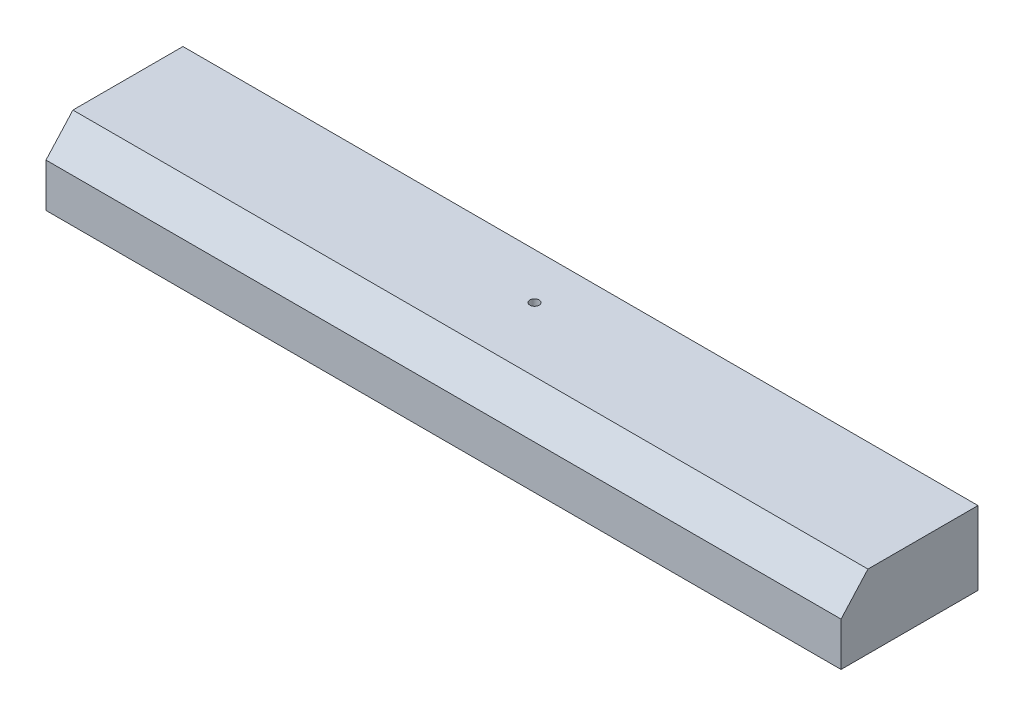
ISO-10303-21;
HEADER;
FILE_DESCRIPTION(('STEP AP214'),'2;1');
FILE_NAME('part.step','',(''),(''),'','','');
FILE_SCHEMA(('AUTOMOTIVE_DESIGN { 1 0 10303 214 1 1 1 1 }'));
ENDSEC;
DATA;
#1=APPLICATION_CONTEXT('core data for automotive mechanical design processes');
#2=APPLICATION_PROTOCOL_DEFINITION('international standard','automotive_design',2000,#1);
#3=PRODUCT_CONTEXT('',#1,'mechanical');
#4=PRODUCT('Part','Part','',(#3));
#5=PRODUCT_RELATED_PRODUCT_CATEGORY('part','',(#4));
#6=PRODUCT_DEFINITION_FORMATION('','',#4);
#7=PRODUCT_DEFINITION_CONTEXT('part definition',#1,'design');
#8=PRODUCT_DEFINITION('design','',#6,#7);
#9=PRODUCT_DEFINITION_SHAPE('','',#8);
#10=(LENGTH_UNIT() NAMED_UNIT(*) SI_UNIT(.MILLI.,.METRE.));
#11=(NAMED_UNIT(*) PLANE_ANGLE_UNIT() SI_UNIT($,.RADIAN.));
#12=(NAMED_UNIT(*) SI_UNIT($,.STERADIAN.) SOLID_ANGLE_UNIT());
#13=UNCERTAINTY_MEASURE_WITH_UNIT(LENGTH_MEASURE(1.E-05),#10,'distance_accuracy_value','');
#14=(GEOMETRIC_REPRESENTATION_CONTEXT(3) GLOBAL_UNCERTAINTY_ASSIGNED_CONTEXT((#13)) GLOBAL_UNIT_ASSIGNED_CONTEXT((#10,
#11,#12)) REPRESENTATION_CONTEXT('',''));
#15=CARTESIAN_POINT('',(0.,0.,0.));
#16=DIRECTION('',(0.,0.,1.));
#17=DIRECTION('',(1.,0.,0.));
#18=AXIS2_PLACEMENT_3D('',#15,#16,#17);
#19=CARTESIAN_POINT('',(81.5,14.,0.));
#20=CARTESIAN_POINT('',(74.436091258729,14.,-13.8819278627372));
#21=CARTESIAN_POINT('',(43.2593569608998,14.,-16.3621882759502));
#22=CARTESIAN_POINT('',(0.,14.,-18.5559275364417));
#23=CARTESIAN_POINT('',(-43.2593569608998,14.,-16.3621882759502));
#24=CARTESIAN_POINT('',(-74.436091258729,14.,-13.8819278627372));
#25=CARTESIAN_POINT('',(-81.5,14.,0.));
#26=B_SPLINE_CURVE_WITH_KNOTS('',3,(#19,#20,#21,#22,#23,#24,#25),.UNSPECIFIED.,.F.,.F.,(4,1,1,1,
4),(0.,0.237125687669127,0.5,0.762874312330873,1.),.UNSPECIFIED.);
#27=DIRECTION('',(0.,-1.,0.));
#28=VECTOR('',#27,1.);
#29=SURFACE_OF_LINEAR_EXTRUSION('',#26,#28);
#30=CARTESIAN_POINT('',(81.5,8.5,0.));
#31=CARTESIAN_POINT('',(74.436091258729,8.5,-13.8819278627372));
#32=CARTESIAN_POINT('',(43.2593569608998,8.5,-16.3621882759502));
#33=CARTESIAN_POINT('',(0.,8.5,-18.5559275364417));
#34=CARTESIAN_POINT('',(-43.2593569608998,8.5,-16.3621882759502));
#35=CARTESIAN_POINT('',(-74.436091258729,8.5,-13.8819278627372));
#36=CARTESIAN_POINT('',(-81.5,8.5,0.));
#37=B_SPLINE_CURVE_WITH_KNOTS('',3,(#30,#31,#32,#33,#34,#35,#36),.UNSPECIFIED.,.F.,.F.,(4,1,1,1,
4),(0.,0.237125687669127,0.5,0.762874312330873,1.),.UNSPECIFIED.);
#38=CARTESIAN_POINT('',(-7.93134864124332,8.5,-17.7313486412434));
#39=VERTEX_POINT('',#38);
#40=CARTESIAN_POINT('',(7.93134864124332,8.5,-17.7313486412434));
#41=VERTEX_POINT('',#40);
#42=EDGE_CURVE('E45',#39,#41,#37,.F.);
#43=ORIENTED_EDGE('',*,*,#42,.F.);
#44=DIRECTION('',(0.,1.,0.));
#45=VECTOR('',#44,1.);
#46=CARTESIAN_POINT('',(-7.93134864124332,8.5,-17.7313486412434));
#47=LINE('',#46,#45);
#48=CARTESIAN_POINT('',(-7.93134864124332,14.,-17.7313486412434));
#49=VERTEX_POINT('',#48);
#50=EDGE_CURVE('E166',#39,#49,#47,.T.);
#51=ORIENTED_EDGE('',*,*,#50,.T.);
#52=CARTESIAN_POINT('',(-81.5,14.,0.));
#53=VERTEX_POINT('',#52);
#54=EDGE_CURVE('E190',#49,#53,#26,.T.);
#55=ORIENTED_EDGE('',*,*,#54,.T.);
#56=DIRECTION('',(0.,-1.,0.));
#57=VECTOR('',#56,1.);
#58=CARTESIAN_POINT('',(-81.5,14.,0.));
#59=LINE('',#58,#57);
#60=CARTESIAN_POINT('',(-81.5,0.,0.));
#61=VERTEX_POINT('',#60);
#62=EDGE_CURVE('E229',#53,#61,#59,.T.);
#63=ORIENTED_EDGE('',*,*,#62,.T.);
#64=CARTESIAN_POINT('',(81.5,0.,0.));
#65=CARTESIAN_POINT('',(74.436091258729,0.,-13.8819278627372));
#66=CARTESIAN_POINT('',(43.2593569608998,0.,-16.3621882759502));
#67=CARTESIAN_POINT('',(0.,0.,-18.5559275364417));
#68=CARTESIAN_POINT('',(-43.2593569608998,0.,-16.3621882759502));
#69=CARTESIAN_POINT('',(-74.436091258729,0.,-13.8819278627372));
#70=CARTESIAN_POINT('',(-81.5,0.,0.));
#71=B_SPLINE_CURVE_WITH_KNOTS('',3,(#64,#65,#66,#67,#68,#69,#70),.UNSPECIFIED.,.F.,.F.,(4,1,1,1,
4),(0.,0.237125687669127,0.5,0.762874312330873,1.),.UNSPECIFIED.);
#72=CARTESIAN_POINT('',(81.5,0.,0.));
#73=VERTEX_POINT('',#72);
#74=EDGE_CURVE('E184',#73,#61,#71,.T.);
#75=ORIENTED_EDGE('',*,*,#74,.F.);
#76=DIRECTION('',(0.,-1.,0.));
#77=VECTOR('',#76,1.);
#78=CARTESIAN_POINT('',(81.5,14.,0.));
#79=LINE('',#78,#77);
#80=CARTESIAN_POINT('',(81.5,14.,0.));
#81=VERTEX_POINT('',#80);
#82=EDGE_CURVE('E265',#81,#73,#79,.T.);
#83=ORIENTED_EDGE('',*,*,#82,.F.);
#84=CARTESIAN_POINT('',(7.93134864124332,14.,-17.7313486412434));
#85=VERTEX_POINT('',#84);
#86=EDGE_CURVE('E165',#81,#85,#26,.T.);
#87=ORIENTED_EDGE('',*,*,#86,.T.);
#88=DIRECTION('',(0.,1.,0.));
#89=VECTOR('',#88,1.);
#90=CARTESIAN_POINT('',(7.93134864124332,8.5,-17.7313486412434));
#91=LINE('',#90,#89);
#92=EDGE_CURVE('E159',#41,#85,#91,.T.);
#93=ORIENTED_EDGE('',*,*,#92,.F.);
#94=EDGE_LOOP('',(#43,#51,#55,#63,#75,#83,#87,#93));
#95=FACE_BOUND('',#94,.T.);
#96=ADVANCED_FACE('F37',(#95),#29,.T.);
#97=CARTESIAN_POINT('',(0.,14.,0.));
#98=DIRECTION('',(0.,-1.,0.));
#99=DIRECTION('',(0.,0.,-1.));
#100=AXIS2_PLACEMENT_3D('',#97,#98,#99);
#101=PLANE('',#100);
#102=DIRECTION('',(-0.707106781186546,0.,-0.707106781186549));
#103=VECTOR('',#102,1.);
#104=CARTESIAN_POINT('',(0.,14.,-9.8));
#105=LINE('',#104,#103);
#106=CARTESIAN_POINT('',(0.,14.,-9.8));
#107=VERTEX_POINT('',#106);
#108=EDGE_CURVE('E161',#107,#49,#105,.T.);
#109=ORIENTED_EDGE('',*,*,#108,.F.);
#110=DIRECTION('',(-0.707106781186546,0.,0.707106781186549));
#111=VECTOR('',#110,1.);
#112=CARTESIAN_POINT('',(7.93134864124332,14.,-17.7313486412434));
#113=LINE('',#112,#111);
#114=EDGE_CURVE('E59',#85,#107,#113,.T.);
#115=ORIENTED_EDGE('',*,*,#114,.F.);
#116=ORIENTED_EDGE('',*,*,#86,.F.);
#117=DIRECTION('',(1.,0.,0.));
#118=VECTOR('',#117,1.);
#119=CARTESIAN_POINT('',(-81.5,14.,0.));
#120=LINE('',#119,#118);
#121=EDGE_CURVE('E189',#53,#81,#120,.T.);
#122=ORIENTED_EDGE('',*,*,#121,.F.);
#123=ORIENTED_EDGE('',*,*,#54,.F.);
#124=EDGE_LOOP('',(#109,#115,#116,#122,#123));
#125=FACE_BOUND('',#124,.T.);
#126=ADVANCED_FACE('F199',(#125),#101,.T.);
#127=CARTESIAN_POINT('',(0.,0.,0.));
#128=DIRECTION('',(0.,1.,0.));
#129=DIRECTION('',(0.,0.,1.));
#130=AXIS2_PLACEMENT_3D('',#127,#128,#129);
#131=PLANE('',#130);
#132=DIRECTION('',(0.,0.,1.));
#133=VECTOR('',#132,1.);
#134=CARTESIAN_POINT('',(-86.5,0.,-22.8));
#135=LINE('',#134,#133);
#136=CARTESIAN_POINT('',(-86.5,0.,-22.8));
#137=VERTEX_POINT('',#136);
#138=CARTESIAN_POINT('',(-86.5,0.,7.));
#139=VERTEX_POINT('',#138);
#140=EDGE_CURVE('E222',#137,#139,#135,.T.);
#141=ORIENTED_EDGE('',*,*,#140,.F.);
#142=DIRECTION('',(-1.,0.,0.));
#143=VECTOR('',#142,1.);
#144=CARTESIAN_POINT('',(86.5,0.,-22.8));
#145=LINE('',#144,#143);
#146=CARTESIAN_POINT('',(86.5,0.,-22.8));
#147=VERTEX_POINT('',#146);
#148=EDGE_CURVE('E227',#147,#137,#145,.T.);
#149=ORIENTED_EDGE('',*,*,#148,.F.);
#150=DIRECTION('',(0.,0.,-1.));
#151=VECTOR('',#150,1.);
#152=CARTESIAN_POINT('',(86.5,0.,7.));
#153=LINE('',#152,#151);
#154=CARTESIAN_POINT('',(86.5,0.,7.));
#155=VERTEX_POINT('',#154);
#156=EDGE_CURVE('E225',#155,#147,#153,.T.);
#157=ORIENTED_EDGE('',*,*,#156,.F.);
#158=DIRECTION('',(1.,0.,0.));
#159=VECTOR('',#158,1.);
#160=CARTESIAN_POINT('',(-86.5,0.,7.));
#161=LINE('',#160,#159);
#162=EDGE_CURVE('E131',#139,#155,#161,.T.);
#163=ORIENTED_EDGE('',*,*,#162,.F.);
#164=EDGE_LOOP('',(#141,#149,#157,#163));
#165=FACE_BOUND('',#164,.T.);
#166=ORIENTED_EDGE('',*,*,#74,.T.);
#167=DIRECTION('',(1.,0.,0.));
#168=VECTOR('',#167,1.);
#169=CARTESIAN_POINT('',(-81.5,0.,0.));
#170=LINE('',#169,#168);
#171=EDGE_CURVE('E258',#61,#73,#170,.T.);
#172=ORIENTED_EDGE('',*,*,#171,.T.);
#173=EDGE_LOOP('',(#166,#172));
#174=FACE_BOUND('',#173,.T.);
#175=ADVANCED_FACE('F202',(#165,#174),#131,.F.);
#176=CARTESIAN_POINT('',(-86.5,14.,-22.8));
#177=DIRECTION('',(1.,0.,0.));
#178=DIRECTION('',(0.,0.,-1.));
#179=AXIS2_PLACEMENT_3D('',#176,#177,#178);
#180=PLANE('',#179);
#181=DIRECTION('',(0.,-1.,0.));
#182=VECTOR('',#181,1.);
#183=CARTESIAN_POINT('',(-86.5,14.,7.));
#184=LINE('',#183,#182);
#185=CARTESIAN_POINT('',(-86.5,9.50000000000002,6.99999999999999));
#186=VERTEX_POINT('',#185);
#187=EDGE_CURVE('E133',#186,#139,#184,.T.);
#188=ORIENTED_EDGE('',*,*,#187,.F.);
#189=DIRECTION('',(0.,0.743144825477391,-0.669130606358862));
#190=VECTOR('',#189,1.);
#191=CARTESIAN_POINT('',(-86.5,-37.,48.86878805985));
#192=LINE('',#191,#190);
#193=CARTESIAN_POINT('',(-86.5,16.,1.14737371206397));
#194=VERTEX_POINT('',#193);
#195=EDGE_CURVE('E115',#186,#194,#192,.T.);
#196=ORIENTED_EDGE('',*,*,#195,.T.);
#197=DIRECTION('',(0.,0.,1.));
#198=VECTOR('',#197,1.);
#199=CARTESIAN_POINT('',(-86.5,16.,7.));
#200=LINE('',#199,#198);
#201=CARTESIAN_POINT('',(-86.5,16.,-22.8));
#202=VERTEX_POINT('',#201);
#203=EDGE_CURVE('E177',#202,#194,#200,.T.);
#204=ORIENTED_EDGE('',*,*,#203,.F.);
#205=DIRECTION('',(0.,-1.,0.));
#206=VECTOR('',#205,1.);
#207=CARTESIAN_POINT('',(-86.5,14.,-22.8));
#208=LINE('',#207,#206);
#209=EDGE_CURVE('E138',#202,#137,#208,.T.);
#210=ORIENTED_EDGE('',*,*,#209,.T.);
#211=ORIENTED_EDGE('',*,*,#140,.T.);
#212=EDGE_LOOP('',(#188,#196,#204,#210,#211));
#213=FACE_BOUND('',#212,.T.);
#214=ADVANCED_FACE('F39',(#213),#180,.F.);
#215=CARTESIAN_POINT('',(-86.5,14.,7.));
#216=DIRECTION('',(0.,0.,-1.));
#217=DIRECTION('',(-1.,0.,0.));
#218=AXIS2_PLACEMENT_3D('',#215,#216,#217);
#219=PLANE('',#218);
#220=DIRECTION('',(0.,-1.,0.));
#221=VECTOR('',#220,1.);
#222=CARTESIAN_POINT('',(86.5,14.,7.));
#223=LINE('',#222,#221);
#224=CARTESIAN_POINT('',(86.5,9.49999999999997,7.00000000000002));
#225=VERTEX_POINT('',#224);
#226=EDGE_CURVE('E124',#225,#155,#223,.T.);
#227=ORIENTED_EDGE('',*,*,#226,.F.);
#228=DIRECTION('',(-1.,0.,0.));
#229=VECTOR('',#228,1.);
#230=CARTESIAN_POINT('',(-86.5,9.49999999999999,7.));
#231=LINE('',#230,#229);
#232=EDGE_CURVE('E112',#225,#186,#231,.T.);
#233=ORIENTED_EDGE('',*,*,#232,.T.);
#234=ORIENTED_EDGE('',*,*,#187,.T.);
#235=ORIENTED_EDGE('',*,*,#162,.T.);
#236=EDGE_LOOP('',(#227,#233,#234,#235));
#237=FACE_BOUND('',#236,.T.);
#238=ADVANCED_FACE('F129',(#237),#219,.F.);
#239=CARTESIAN_POINT('',(86.5,14.,7.));
#240=DIRECTION('',(-1.,0.,0.));
#241=DIRECTION('',(0.,0.,1.));
#242=AXIS2_PLACEMENT_3D('',#239,#240,#241);
#243=PLANE('',#242);
#244=DIRECTION('',(0.,0.,-1.));
#245=VECTOR('',#244,1.);
#246=CARTESIAN_POINT('',(86.5,16.,-22.8));
#247=LINE('',#246,#245);
#248=CARTESIAN_POINT('',(86.5,16.,1.14737371206397));
#249=VERTEX_POINT('',#248);
#250=CARTESIAN_POINT('',(86.5,16.,-22.8));
#251=VERTEX_POINT('',#250);
#252=EDGE_CURVE('E127',#249,#251,#247,.T.);
#253=ORIENTED_EDGE('',*,*,#252,.F.);
#254=DIRECTION('',(0.,0.743144825477391,-0.669130606358862));
#255=VECTOR('',#254,1.);
#256=CARTESIAN_POINT('',(86.5,-37.,48.86878805985));
#257=LINE('',#256,#255);
#258=EDGE_CURVE('E52',#225,#249,#257,.T.);
#259=ORIENTED_EDGE('',*,*,#258,.F.);
#260=ORIENTED_EDGE('',*,*,#226,.T.);
#261=ORIENTED_EDGE('',*,*,#156,.T.);
#262=DIRECTION('',(0.,-1.,0.));
#263=VECTOR('',#262,1.);
#264=CARTESIAN_POINT('',(86.5,14.,-22.8));
#265=LINE('',#264,#263);
#266=EDGE_CURVE('E134',#251,#147,#265,.T.);
#267=ORIENTED_EDGE('',*,*,#266,.F.);
#268=EDGE_LOOP('',(#253,#259,#260,#261,#267));
#269=FACE_BOUND('',#268,.T.);
#270=ADVANCED_FACE('F123',(#269),#243,.F.);
#271=CARTESIAN_POINT('',(86.5,14.,-22.8));
#272=DIRECTION('',(0.,0.,1.));
#273=DIRECTION('',(1.,0.,0.));
#274=AXIS2_PLACEMENT_3D('',#271,#272,#273);
#275=PLANE('',#274);
#276=ORIENTED_EDGE('',*,*,#148,.T.);
#277=ORIENTED_EDGE('',*,*,#209,.F.);
#278=DIRECTION('',(-1.,0.,0.));
#279=VECTOR('',#278,1.);
#280=CARTESIAN_POINT('',(-86.5,16.,-22.8));
#281=LINE('',#280,#279);
#282=EDGE_CURVE('E181',#251,#202,#281,.T.);
#283=ORIENTED_EDGE('',*,*,#282,.F.);
#284=ORIENTED_EDGE('',*,*,#266,.T.);
#285=EDGE_LOOP('',(#276,#277,#283,#284));
#286=FACE_BOUND('',#285,.T.);
#287=ADVANCED_FACE('F206',(#286),#275,.F.);
#288=CARTESIAN_POINT('',(-81.5,14.,0.));
#289=DIRECTION('',(0.,0.,-1.));
#290=DIRECTION('',(-1.,0.,0.));
#291=AXIS2_PLACEMENT_3D('',#288,#289,#290);
#292=PLANE('',#291);
#293=ORIENTED_EDGE('',*,*,#171,.F.);
#294=ORIENTED_EDGE('',*,*,#62,.F.);
#295=ORIENTED_EDGE('',*,*,#121,.T.);
#296=ORIENTED_EDGE('',*,*,#82,.T.);
#297=EDGE_LOOP('',(#293,#294,#295,#296));
#298=FACE_BOUND('',#297,.T.);
#299=ADVANCED_FACE('F200',(#298),#292,.T.);
#300=CARTESIAN_POINT('',(0.,16.,0.));
#301=DIRECTION('',(0.,-1.,0.));
#302=DIRECTION('',(0.,0.,-1.));
#303=AXIS2_PLACEMENT_3D('',#300,#301,#302);
#304=PLANE('',#303);
#305=ORIENTED_EDGE('',*,*,#203,.T.);
#306=DIRECTION('',(1.,0.,0.));
#307=VECTOR('',#306,1.);
#308=CARTESIAN_POINT('',(0.,16.,1.14737371206398));
#309=LINE('',#308,#307);
#310=EDGE_CURVE('E11',#194,#249,#309,.T.);
#311=ORIENTED_EDGE('',*,*,#310,.T.);
#312=ORIENTED_EDGE('',*,*,#252,.T.);
#313=ORIENTED_EDGE('',*,*,#282,.T.);
#314=EDGE_LOOP('',(#305,#311,#312,#313));
#315=FACE_BOUND('',#314,.T.);
#316=CARTESIAN_POINT('',(0.,16.,-12.8));
#317=DIRECTION('',(0.,1.,0.));
#318=DIRECTION('',(0.,0.,1.));
#319=AXIS2_PLACEMENT_3D('',#316,#317,#318);
#320=CIRCLE('',#319,0.999999999999999);
#321=CARTESIAN_POINT('',(0.,16.,-11.8));
#322=VERTEX_POINT('',#321);
#323=EDGE_CURVE('E174',#322,#322,#320,.T.);
#324=ORIENTED_EDGE('',*,*,#323,.F.);
#325=EDGE_LOOP('',(#324));
#326=FACE_BOUND('',#325,.T.);
#327=ADVANCED_FACE('F235',(#315,#326),#304,.F.);
#328=CARTESIAN_POINT('',(0.,16.,-12.8));
#329=DIRECTION('',(0.,-1.,0.));
#330=DIRECTION('',(0.,0.,-1.));
#331=AXIS2_PLACEMENT_3D('',#328,#329,#330);
#332=CYLINDRICAL_SURFACE('',#331,0.999999999999999);
#333=ORIENTED_EDGE('',*,*,#323,.T.);
#334=EDGE_LOOP('',(#333));
#335=FACE_BOUND('',#334,.T.);
#336=CARTESIAN_POINT('',(0.,8.5,-12.8));
#337=DIRECTION('',(0.,-1.,0.));
#338=DIRECTION('',(0.,0.,-1.));
#339=AXIS2_PLACEMENT_3D('',#336,#337,#338);
#340=CIRCLE('',#339,0.999999999999999);
#341=CARTESIAN_POINT('',(0.,8.5,-13.8));
#342=VERTEX_POINT('',#341);
#343=EDGE_CURVE('E119',#342,#342,#340,.T.);
#344=ORIENTED_EDGE('',*,*,#343,.T.);
#345=EDGE_LOOP('',(#344));
#346=FACE_BOUND('',#345,.T.);
#347=ADVANCED_FACE('F238',(#335,#346),#332,.F.);
#348=CARTESIAN_POINT('',(0.,8.5,0.));
#349=DIRECTION('',(0.,-1.,0.));
#350=DIRECTION('',(0.,0.,-1.));
#351=AXIS2_PLACEMENT_3D('',#348,#349,#350);
#352=PLANE('',#351);
#353=DIRECTION('',(-0.707106781186546,0.,-0.707106781186549));
#354=VECTOR('',#353,1.);
#355=CARTESIAN_POINT('',(0.,8.5,-9.8));
#356=LINE('',#355,#354);
#357=CARTESIAN_POINT('',(0.,8.5,-9.8));
#358=VERTEX_POINT('',#357);
#359=EDGE_CURVE('E153',#358,#39,#356,.T.);
#360=ORIENTED_EDGE('',*,*,#359,.T.);
#361=ORIENTED_EDGE('',*,*,#42,.T.);
#362=DIRECTION('',(-0.707106781186546,0.,0.707106781186549));
#363=VECTOR('',#362,1.);
#364=CARTESIAN_POINT('',(7.93134864124332,8.5,-17.7313486412434));
#365=LINE('',#364,#363);
#366=EDGE_CURVE('E152',#41,#358,#365,.T.);
#367=ORIENTED_EDGE('',*,*,#366,.T.);
#368=EDGE_LOOP('',(#360,#361,#367));
#369=FACE_BOUND('',#368,.T.);
#370=ORIENTED_EDGE('',*,*,#343,.F.);
#371=EDGE_LOOP('',(#370));
#372=FACE_BOUND('',#371,.T.);
#373=ADVANCED_FACE('F150',(#369,#372),#352,.T.);
#374=CARTESIAN_POINT('',(7.93134864124332,8.5,-17.7313486412434));
#375=DIRECTION('',(-0.707106781186549,0.,-0.707106781186546));
#376=DIRECTION('',(-0.707106781186546,0.,0.707106781186549));
#377=AXIS2_PLACEMENT_3D('',#374,#375,#376);
#378=PLANE('',#377);
#379=ORIENTED_EDGE('',*,*,#114,.T.);
#380=DIRECTION('',(0.,1.,0.));
#381=VECTOR('',#380,1.);
#382=CARTESIAN_POINT('',(0.,8.5,-9.8));
#383=LINE('',#382,#381);
#384=EDGE_CURVE('E160',#358,#107,#383,.T.);
#385=ORIENTED_EDGE('',*,*,#384,.F.);
#386=ORIENTED_EDGE('',*,*,#366,.F.);
#387=ORIENTED_EDGE('',*,*,#92,.T.);
#388=EDGE_LOOP('',(#379,#385,#386,#387));
#389=FACE_BOUND('',#388,.T.);
#390=ADVANCED_FACE('F158',(#389),#378,.F.);
#391=CARTESIAN_POINT('',(0.,8.5,-9.8));
#392=DIRECTION('',(0.707106781186549,0.,-0.707106781186546));
#393=DIRECTION('',(-0.707106781186546,0.,-0.707106781186549));
#394=AXIS2_PLACEMENT_3D('',#391,#392,#393);
#395=PLANE('',#394);
#396=ORIENTED_EDGE('',*,*,#108,.T.);
#397=ORIENTED_EDGE('',*,*,#50,.F.);
#398=ORIENTED_EDGE('',*,*,#359,.F.);
#399=ORIENTED_EDGE('',*,*,#384,.T.);
#400=EDGE_LOOP('',(#396,#397,#398,#399));
#401=FACE_BOUND('',#400,.T.);
#402=ADVANCED_FACE('F251',(#401),#395,.F.);
#403=CARTESIAN_POINT('',(-86.5,-37.,48.86878805985));
#404=DIRECTION('',(0.,-0.669130606358862,-0.743144825477391));
#405=DIRECTION('',(0.,0.743144825477391,-0.669130606358862));
#406=AXIS2_PLACEMENT_3D('',#403,#404,#405);
#407=PLANE('',#406);
#408=ORIENTED_EDGE('',*,*,#258,.T.);
#409=ORIENTED_EDGE('',*,*,#310,.F.);
#410=ORIENTED_EDGE('',*,*,#195,.F.);
#411=ORIENTED_EDGE('',*,*,#232,.F.);
#412=EDGE_LOOP('',(#408,#409,#410,#411));
#413=FACE_BOUND('',#412,.T.);
#414=ADVANCED_FACE('F113',(#413),#407,.F.);
#415=CLOSED_SHELL('',(#96,#126,#175,#214,#238,#270,#287,#299,#327,#347,#373,#390,#402,#414));
#416=MANIFOLD_SOLID_BREP('B2',#415);
#417=ADVANCED_BREP_SHAPE_REPRESENTATION('',(#18,#416),#14);
#418=SHAPE_DEFINITION_REPRESENTATION(#9,#417);
ENDSEC;
END-ISO-10303-21;
